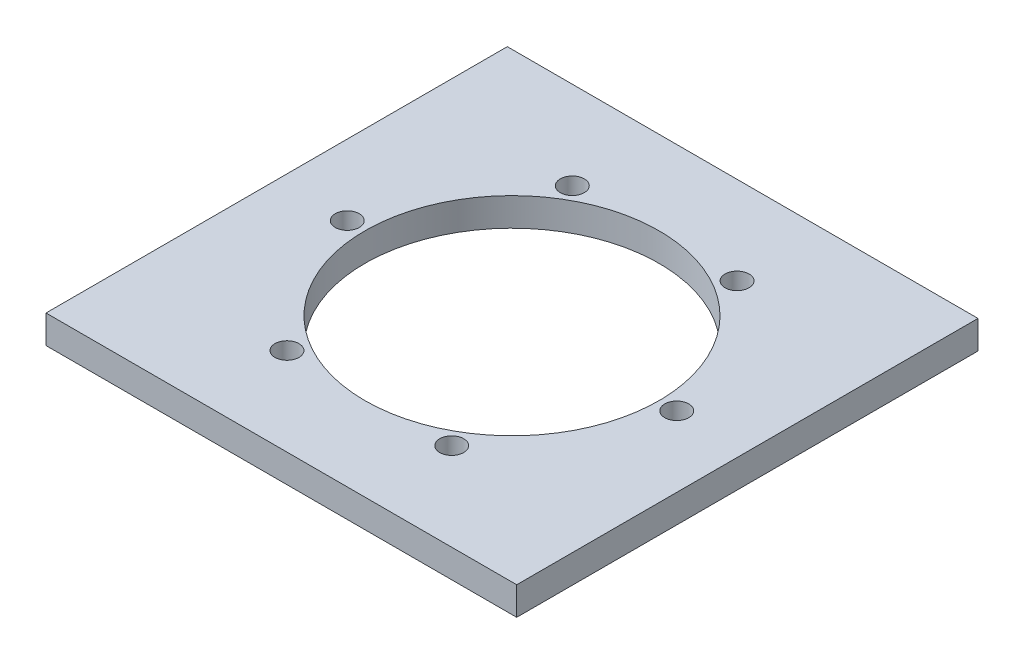
ISO-10303-21;
HEADER;
FILE_DESCRIPTION(('STEP AP214'),'2;1');
FILE_NAME('part.step','',(''),(''),'','','');
FILE_SCHEMA(('AUTOMOTIVE_DESIGN { 1 0 10303 214 1 1 1 1 }'));
ENDSEC;
DATA;
#1=APPLICATION_CONTEXT('core data for automotive mechanical design processes');
#2=APPLICATION_PROTOCOL_DEFINITION('international standard','automotive_design',2000,#1);
#3=PRODUCT_CONTEXT('',#1,'mechanical');
#4=PRODUCT('Part','Part','',(#3));
#5=PRODUCT_RELATED_PRODUCT_CATEGORY('part','',(#4));
#6=PRODUCT_DEFINITION_FORMATION('','',#4);
#7=PRODUCT_DEFINITION_CONTEXT('part definition',#1,'design');
#8=PRODUCT_DEFINITION('design','',#6,#7);
#9=PRODUCT_DEFINITION_SHAPE('','',#8);
#10=(LENGTH_UNIT() NAMED_UNIT(*) SI_UNIT(.MILLI.,.METRE.));
#11=(NAMED_UNIT(*) PLANE_ANGLE_UNIT() SI_UNIT($,.RADIAN.));
#12=(NAMED_UNIT(*) SI_UNIT($,.STERADIAN.) SOLID_ANGLE_UNIT());
#13=UNCERTAINTY_MEASURE_WITH_UNIT(LENGTH_MEASURE(1.E-05),#10,'distance_accuracy_value','');
#14=(GEOMETRIC_REPRESENTATION_CONTEXT(3) GLOBAL_UNCERTAINTY_ASSIGNED_CONTEXT((#13)) GLOBAL_UNIT_ASSIGNED_CONTEXT((#10,
#11,#12)) REPRESENTATION_CONTEXT('',''));
#15=CARTESIAN_POINT('',(0.,0.,0.));
#16=DIRECTION('',(0.,0.,1.));
#17=DIRECTION('',(1.,0.,0.));
#18=AXIS2_PLACEMENT_3D('',#15,#16,#17);
#19=CARTESIAN_POINT('',(0.,0.,0.));
#20=DIRECTION('',(0.,-1.,0.));
#21=DIRECTION('',(0.,0.,-1.));
#22=AXIS2_PLACEMENT_3D('',#19,#20,#21);
#23=PLANE('',#22);
#24=DIRECTION('',(0.,0.,-1.));
#25=VECTOR('',#24,1.);
#26=CARTESIAN_POINT('',(-100.,0.,98.));
#27=LINE('',#26,#25);
#28=CARTESIAN_POINT('',(-100.,0.,98.));
#29=VERTEX_POINT('',#28);
#30=CARTESIAN_POINT('',(-100.,0.,-98.));
#31=VERTEX_POINT('',#30);
#32=EDGE_CURVE('E56',#29,#31,#27,.T.);
#33=ORIENTED_EDGE('',*,*,#32,.T.);
#34=DIRECTION('',(1.,0.,0.));
#35=VECTOR('',#34,1.);
#36=CARTESIAN_POINT('',(-100.,0.,-98.));
#37=LINE('',#36,#35);
#38=CARTESIAN_POINT('',(100.,0.,-98.));
#39=VERTEX_POINT('',#38);
#40=EDGE_CURVE('E265',#31,#39,#37,.T.);
#41=ORIENTED_EDGE('',*,*,#40,.T.);
#42=DIRECTION('',(0.,0.,1.));
#43=VECTOR('',#42,1.);
#44=CARTESIAN_POINT('',(100.,0.,98.));
#45=LINE('',#44,#43);
#46=CARTESIAN_POINT('',(100.,0.,98.));
#47=VERTEX_POINT('',#46);
#48=EDGE_CURVE('E61',#39,#47,#45,.T.);
#49=ORIENTED_EDGE('',*,*,#48,.T.);
#50=DIRECTION('',(-1.,0.,0.));
#51=VECTOR('',#50,1.);
#52=CARTESIAN_POINT('',(-100.,0.,98.));
#53=LINE('',#52,#51);
#54=EDGE_CURVE('E59',#47,#29,#53,.T.);
#55=ORIENTED_EDGE('',*,*,#54,.T.);
#56=EDGE_LOOP('',(#33,#41,#49,#55));
#57=FACE_BOUND('',#56,.T.);
#58=CARTESIAN_POINT('',(0.,0.,0.));
#59=DIRECTION('',(0.,1.,0.));
#60=DIRECTION('',(0.,0.,1.));
#61=AXIS2_PLACEMENT_3D('',#58,#59,#60);
#62=CIRCLE('',#61,62.5);
#63=CARTESIAN_POINT('',(0.,0.,62.5));
#64=VERTEX_POINT('',#63);
#65=EDGE_CURVE('E109',#64,#64,#62,.T.);
#66=ORIENTED_EDGE('',*,*,#65,.T.);
#67=EDGE_LOOP('',(#66));
#68=FACE_BOUND('',#67,.T.);
#69=CARTESIAN_POINT('',(-70.,0.,0.));
#70=DIRECTION('',(0.,1.,0.));
#71=DIRECTION('',(0.,0.,1.));
#72=AXIS2_PLACEMENT_3D('',#69,#70,#71);
#73=CIRCLE('',#72,5.1);
#74=CARTESIAN_POINT('',(-70.,0.,5.10000000000001));
#75=VERTEX_POINT('',#74);
#76=EDGE_CURVE('E106',#75,#75,#73,.T.);
#77=ORIENTED_EDGE('',*,*,#76,.T.);
#78=EDGE_LOOP('',(#77));
#79=FACE_BOUND('',#78,.T.);
#80=CARTESIAN_POINT('',(-35.,0.,60.6217782649108));
#81=DIRECTION('',(0.,1.,0.));
#82=DIRECTION('',(0.,0.,1.));
#83=AXIS2_PLACEMENT_3D('',#80,#81,#82);
#84=CIRCLE('',#83,5.1);
#85=CARTESIAN_POINT('',(-35.,0.,65.7217782649108));
#86=VERTEX_POINT('',#85);
#87=EDGE_CURVE('E103',#86,#86,#84,.T.);
#88=ORIENTED_EDGE('',*,*,#87,.T.);
#89=EDGE_LOOP('',(#88));
#90=FACE_BOUND('',#89,.T.);
#91=CARTESIAN_POINT('',(35.,0.,60.6217782649106));
#92=DIRECTION('',(0.,1.,0.));
#93=DIRECTION('',(0.,0.,1.));
#94=AXIS2_PLACEMENT_3D('',#91,#92,#93);
#95=CIRCLE('',#94,5.1);
#96=CARTESIAN_POINT('',(35.,0.,65.7217782649106));
#97=VERTEX_POINT('',#96);
#98=EDGE_CURVE('E100',#97,#97,#95,.T.);
#99=ORIENTED_EDGE('',*,*,#98,.T.);
#100=EDGE_LOOP('',(#99));
#101=FACE_BOUND('',#100,.T.);
#102=CARTESIAN_POINT('',(70.,0.,0.));
#103=DIRECTION('',(0.,1.,0.));
#104=DIRECTION('',(0.,0.,1.));
#105=AXIS2_PLACEMENT_3D('',#102,#103,#104);
#106=CIRCLE('',#105,5.1);
#107=CARTESIAN_POINT('',(70.,0.,5.09999999999999));
#108=VERTEX_POINT('',#107);
#109=EDGE_CURVE('E67',#108,#108,#106,.T.);
#110=ORIENTED_EDGE('',*,*,#109,.T.);
#111=EDGE_LOOP('',(#110));
#112=FACE_BOUND('',#111,.T.);
#113=CARTESIAN_POINT('',(34.9999999999995,0.,-60.621778264911));
#114=DIRECTION('',(0.,1.,0.));
#115=DIRECTION('',(0.,0.,1.));
#116=AXIS2_PLACEMENT_3D('',#113,#114,#115);
#117=CIRCLE('',#116,5.1);
#118=CARTESIAN_POINT('',(34.9999999999995,0.,-55.521778264911));
#119=VERTEX_POINT('',#118);
#120=EDGE_CURVE('E113',#119,#119,#117,.T.);
#121=ORIENTED_EDGE('',*,*,#120,.T.);
#122=EDGE_LOOP('',(#121));
#123=FACE_BOUND('',#122,.T.);
#124=CARTESIAN_POINT('',(-35.0000000000007,0.,-60.6217782649103));
#125=DIRECTION('',(0.,1.,0.));
#126=DIRECTION('',(0.,0.,1.));
#127=AXIS2_PLACEMENT_3D('',#124,#125,#126);
#128=CIRCLE('',#127,5.1);
#129=CARTESIAN_POINT('',(-35.0000000000007,0.,-55.5217782649103));
#130=VERTEX_POINT('',#129);
#131=EDGE_CURVE('E20',#130,#130,#128,.T.);
#132=ORIENTED_EDGE('',*,*,#131,.T.);
#133=EDGE_LOOP('',(#132));
#134=FACE_BOUND('',#133,.T.);
#135=ADVANCED_FACE('F17',(#57,#68,#79,#90,#101,#112,#123,#134),#23,.T.);
#136=CARTESIAN_POINT('',(-35.0000000000007,12.,-60.6217782649103));
#137=DIRECTION('',(0.,1.,0.));
#138=DIRECTION('',(0.,0.,1.));
#139=AXIS2_PLACEMENT_3D('',#136,#137,#138);
#140=CYLINDRICAL_SURFACE('',#139,5.1);
#141=ORIENTED_EDGE('',*,*,#131,.F.);
#142=EDGE_LOOP('',(#141));
#143=FACE_BOUND('',#142,.T.);
#144=CARTESIAN_POINT('',(-35.0000000000007,12.,-60.6217782649103));
#145=DIRECTION('',(0.,1.,0.));
#146=DIRECTION('',(0.,0.,1.));
#147=AXIS2_PLACEMENT_3D('',#144,#145,#146);
#148=CIRCLE('',#147,5.1);
#149=CARTESIAN_POINT('',(-35.0000000000007,12.,-55.5217782649103));
#150=VERTEX_POINT('',#149);
#151=EDGE_CURVE('E97',#150,#150,#148,.T.);
#152=ORIENTED_EDGE('',*,*,#151,.T.);
#153=EDGE_LOOP('',(#152));
#154=FACE_BOUND('',#153,.T.);
#155=ADVANCED_FACE('F121',(#143,#154),#140,.F.);
#156=CARTESIAN_POINT('',(34.9999999999995,12.,-60.621778264911));
#157=DIRECTION('',(0.,1.,0.));
#158=DIRECTION('',(0.,0.,1.));
#159=AXIS2_PLACEMENT_3D('',#156,#157,#158);
#160=CYLINDRICAL_SURFACE('',#159,5.1);
#161=ORIENTED_EDGE('',*,*,#120,.F.);
#162=EDGE_LOOP('',(#161));
#163=FACE_BOUND('',#162,.T.);
#164=CARTESIAN_POINT('',(34.9999999999995,12.,-60.621778264911));
#165=DIRECTION('',(0.,1.,0.));
#166=DIRECTION('',(0.,0.,1.));
#167=AXIS2_PLACEMENT_3D('',#164,#165,#166);
#168=CIRCLE('',#167,5.1);
#169=CARTESIAN_POINT('',(34.9999999999995,12.,-55.521778264911));
#170=VERTEX_POINT('',#169);
#171=EDGE_CURVE('E94',#170,#170,#168,.T.);
#172=ORIENTED_EDGE('',*,*,#171,.T.);
#173=EDGE_LOOP('',(#172));
#174=FACE_BOUND('',#173,.T.);
#175=ADVANCED_FACE('F124',(#163,#174),#160,.F.);
#176=CARTESIAN_POINT('',(70.,12.,0.));
#177=DIRECTION('',(0.,1.,0.));
#178=DIRECTION('',(0.,0.,1.));
#179=AXIS2_PLACEMENT_3D('',#176,#177,#178);
#180=CYLINDRICAL_SURFACE('',#179,5.1);
#181=ORIENTED_EDGE('',*,*,#109,.F.);
#182=EDGE_LOOP('',(#181));
#183=FACE_BOUND('',#182,.T.);
#184=CARTESIAN_POINT('',(70.,12.,0.));
#185=DIRECTION('',(0.,1.,0.));
#186=DIRECTION('',(0.,0.,1.));
#187=AXIS2_PLACEMENT_3D('',#184,#185,#186);
#188=CIRCLE('',#187,5.1);
#189=CARTESIAN_POINT('',(70.,12.,5.09999999999999));
#190=VERTEX_POINT('',#189);
#191=EDGE_CURVE('E91',#190,#190,#188,.T.);
#192=ORIENTED_EDGE('',*,*,#191,.T.);
#193=EDGE_LOOP('',(#192));
#194=FACE_BOUND('',#193,.T.);
#195=ADVANCED_FACE('F165',(#183,#194),#180,.F.);
#196=CARTESIAN_POINT('',(-100.,12.,98.));
#197=DIRECTION('',(0.,0.,-1.));
#198=DIRECTION('',(-1.,0.,0.));
#199=AXIS2_PLACEMENT_3D('',#196,#197,#198);
#200=PLANE('',#199);
#201=DIRECTION('',(0.,1.,0.));
#202=VECTOR('',#201,1.);
#203=CARTESIAN_POINT('',(100.,12.,98.));
#204=LINE('',#203,#202);
#205=CARTESIAN_POINT('',(100.,12.,98.));
#206=VERTEX_POINT('',#205);
#207=EDGE_CURVE('E275',#47,#206,#204,.T.);
#208=ORIENTED_EDGE('',*,*,#207,.T.);
#209=DIRECTION('',(1.,0.,0.));
#210=VECTOR('',#209,1.);
#211=CARTESIAN_POINT('',(0.,12.,98.));
#212=LINE('',#211,#210);
#213=CARTESIAN_POINT('',(-100.,12.,98.));
#214=VERTEX_POINT('',#213);
#215=EDGE_CURVE('E78',#206,#214,#212,.F.);
#216=ORIENTED_EDGE('',*,*,#215,.T.);
#217=DIRECTION('',(0.,1.,0.));
#218=VECTOR('',#217,1.);
#219=CARTESIAN_POINT('',(-100.,12.,98.));
#220=LINE('',#219,#218);
#221=EDGE_CURVE('E66',#214,#29,#220,.F.);
#222=ORIENTED_EDGE('',*,*,#221,.T.);
#223=ORIENTED_EDGE('',*,*,#54,.F.);
#224=EDGE_LOOP('',(#208,#216,#222,#223));
#225=FACE_BOUND('',#224,.T.);
#226=ADVANCED_FACE('F77',(#225),#200,.F.);
#227=CARTESIAN_POINT('',(-100.,12.,98.));
#228=DIRECTION('',(1.,0.,0.));
#229=DIRECTION('',(0.,0.,-1.));
#230=AXIS2_PLACEMENT_3D('',#227,#228,#229);
#231=PLANE('',#230);
#232=ORIENTED_EDGE('',*,*,#221,.F.);
#233=DIRECTION('',(0.,0.,-1.));
#234=VECTOR('',#233,1.);
#235=CARTESIAN_POINT('',(-100.,12.,0.));
#236=LINE('',#235,#234);
#237=CARTESIAN_POINT('',(-100.,12.,-98.));
#238=VERTEX_POINT('',#237);
#239=EDGE_CURVE('E267',#214,#238,#236,.T.);
#240=ORIENTED_EDGE('',*,*,#239,.T.);
#241=DIRECTION('',(0.,1.,0.));
#242=VECTOR('',#241,1.);
#243=CARTESIAN_POINT('',(-100.,12.,-98.));
#244=LINE('',#243,#242);
#245=EDGE_CURVE('E74',#238,#31,#244,.F.);
#246=ORIENTED_EDGE('',*,*,#245,.T.);
#247=ORIENTED_EDGE('',*,*,#32,.F.);
#248=EDGE_LOOP('',(#232,#240,#246,#247));
#249=FACE_BOUND('',#248,.T.);
#250=ADVANCED_FACE('F71',(#249),#231,.F.);
#251=CARTESIAN_POINT('',(-100.,12.,-98.));
#252=DIRECTION('',(0.,0.,1.));
#253=DIRECTION('',(1.,0.,0.));
#254=AXIS2_PLACEMENT_3D('',#251,#252,#253);
#255=PLANE('',#254);
#256=ORIENTED_EDGE('',*,*,#245,.F.);
#257=DIRECTION('',(1.,0.,0.));
#258=VECTOR('',#257,1.);
#259=CARTESIAN_POINT('',(0.,12.,-98.));
#260=LINE('',#259,#258);
#261=CARTESIAN_POINT('',(100.,12.,-98.));
#262=VERTEX_POINT('',#261);
#263=EDGE_CURVE('E264',#238,#262,#260,.T.);
#264=ORIENTED_EDGE('',*,*,#263,.T.);
#265=DIRECTION('',(0.,1.,0.));
#266=VECTOR('',#265,1.);
#267=CARTESIAN_POINT('',(100.,12.,-98.));
#268=LINE('',#267,#266);
#269=EDGE_CURVE('E35',#262,#39,#268,.F.);
#270=ORIENTED_EDGE('',*,*,#269,.T.);
#271=ORIENTED_EDGE('',*,*,#40,.F.);
#272=EDGE_LOOP('',(#256,#264,#270,#271));
#273=FACE_BOUND('',#272,.T.);
#274=ADVANCED_FACE('F157',(#273),#255,.F.);
#275=CARTESIAN_POINT('',(100.,12.,98.));
#276=DIRECTION('',(-1.,0.,0.));
#277=DIRECTION('',(0.,0.,1.));
#278=AXIS2_PLACEMENT_3D('',#275,#276,#277);
#279=PLANE('',#278);
#280=ORIENTED_EDGE('',*,*,#269,.F.);
#281=DIRECTION('',(0.,0.,-1.));
#282=VECTOR('',#281,1.);
#283=CARTESIAN_POINT('',(100.,12.,0.));
#284=LINE('',#283,#282);
#285=EDGE_CURVE('E90',#262,#206,#284,.F.);
#286=ORIENTED_EDGE('',*,*,#285,.T.);
#287=ORIENTED_EDGE('',*,*,#207,.F.);
#288=ORIENTED_EDGE('',*,*,#48,.F.);
#289=EDGE_LOOP('',(#280,#286,#287,#288));
#290=FACE_BOUND('',#289,.T.);
#291=ADVANCED_FACE('F153',(#290),#279,.F.);
#292=CARTESIAN_POINT('',(0.,0.,0.));
#293=DIRECTION('',(0.,1.,0.));
#294=DIRECTION('',(0.,0.,1.));
#295=AXIS2_PLACEMENT_3D('',#292,#293,#294);
#296=CYLINDRICAL_SURFACE('',#295,62.5);
#297=ORIENTED_EDGE('',*,*,#65,.F.);
#298=EDGE_LOOP('',(#297));
#299=FACE_BOUND('',#298,.T.);
#300=CARTESIAN_POINT('',(0.,12.,0.));
#301=DIRECTION('',(0.,1.,0.));
#302=DIRECTION('',(0.,0.,1.));
#303=AXIS2_PLACEMENT_3D('',#300,#301,#302);
#304=CIRCLE('',#303,62.5);
#305=CARTESIAN_POINT('',(0.,12.,62.5));
#306=VERTEX_POINT('',#305);
#307=EDGE_CURVE('E87',#306,#306,#304,.T.);
#308=ORIENTED_EDGE('',*,*,#307,.T.);
#309=EDGE_LOOP('',(#308));
#310=FACE_BOUND('',#309,.T.);
#311=ADVANCED_FACE('F149',(#299,#310),#296,.F.);
#312=CARTESIAN_POINT('',(-70.,12.,0.));
#313=DIRECTION('',(0.,1.,0.));
#314=DIRECTION('',(0.,0.,1.));
#315=AXIS2_PLACEMENT_3D('',#312,#313,#314);
#316=CYLINDRICAL_SURFACE('',#315,5.1);
#317=ORIENTED_EDGE('',*,*,#76,.F.);
#318=EDGE_LOOP('',(#317));
#319=FACE_BOUND('',#318,.T.);
#320=CARTESIAN_POINT('',(-70.,12.,0.));
#321=DIRECTION('',(0.,1.,0.));
#322=DIRECTION('',(0.,0.,1.));
#323=AXIS2_PLACEMENT_3D('',#320,#321,#322);
#324=CIRCLE('',#323,5.1);
#325=CARTESIAN_POINT('',(-70.,12.,5.10000000000001));
#326=VERTEX_POINT('',#325);
#327=EDGE_CURVE('E84',#326,#326,#324,.T.);
#328=ORIENTED_EDGE('',*,*,#327,.T.);
#329=EDGE_LOOP('',(#328));
#330=FACE_BOUND('',#329,.T.);
#331=ADVANCED_FACE('F145',(#319,#330),#316,.F.);
#332=CARTESIAN_POINT('',(-35.,12.,60.6217782649108));
#333=DIRECTION('',(0.,1.,0.));
#334=DIRECTION('',(0.,0.,1.));
#335=AXIS2_PLACEMENT_3D('',#332,#333,#334);
#336=CYLINDRICAL_SURFACE('',#335,5.1);
#337=ORIENTED_EDGE('',*,*,#87,.F.);
#338=EDGE_LOOP('',(#337));
#339=FACE_BOUND('',#338,.T.);
#340=CARTESIAN_POINT('',(-35.,12.,60.6217782649108));
#341=DIRECTION('',(0.,1.,0.));
#342=DIRECTION('',(0.,0.,1.));
#343=AXIS2_PLACEMENT_3D('',#340,#341,#342);
#344=CIRCLE('',#343,5.1);
#345=CARTESIAN_POINT('',(-35.,12.,65.7217782649108));
#346=VERTEX_POINT('',#345);
#347=EDGE_CURVE('E26',#346,#346,#344,.T.);
#348=ORIENTED_EDGE('',*,*,#347,.T.);
#349=EDGE_LOOP('',(#348));
#350=FACE_BOUND('',#349,.T.);
#351=ADVANCED_FACE('F137',(#339,#350),#336,.F.);
#352=CARTESIAN_POINT('',(35.,12.,60.6217782649106));
#353=DIRECTION('',(0.,1.,0.));
#354=DIRECTION('',(0.,0.,1.));
#355=AXIS2_PLACEMENT_3D('',#352,#353,#354);
#356=CYLINDRICAL_SURFACE('',#355,5.1);
#357=ORIENTED_EDGE('',*,*,#98,.F.);
#358=EDGE_LOOP('',(#357));
#359=FACE_BOUND('',#358,.T.);
#360=CARTESIAN_POINT('',(35.,12.,60.6217782649106));
#361=DIRECTION('',(0.,1.,0.));
#362=DIRECTION('',(0.,0.,1.));
#363=AXIS2_PLACEMENT_3D('',#360,#361,#362);
#364=CIRCLE('',#363,5.1);
#365=CARTESIAN_POINT('',(35.,12.,65.7217782649106));
#366=VERTEX_POINT('',#365);
#367=EDGE_CURVE('E11',#366,#366,#364,.T.);
#368=ORIENTED_EDGE('',*,*,#367,.T.);
#369=EDGE_LOOP('',(#368));
#370=FACE_BOUND('',#369,.T.);
#371=ADVANCED_FACE('F129',(#359,#370),#356,.F.);
#372=CARTESIAN_POINT('',(0.,12.,0.));
#373=DIRECTION('',(0.,-1.,0.));
#374=DIRECTION('',(0.,0.,-1.));
#375=AXIS2_PLACEMENT_3D('',#372,#373,#374);
#376=PLANE('',#375);
#377=ORIENTED_EDGE('',*,*,#367,.F.);
#378=EDGE_LOOP('',(#377));
#379=FACE_BOUND('',#378,.T.);
#380=ORIENTED_EDGE('',*,*,#347,.F.);
#381=EDGE_LOOP('',(#380));
#382=FACE_BOUND('',#381,.T.);
#383=ORIENTED_EDGE('',*,*,#327,.F.);
#384=EDGE_LOOP('',(#383));
#385=FACE_BOUND('',#384,.T.);
#386=ORIENTED_EDGE('',*,*,#307,.F.);
#387=EDGE_LOOP('',(#386));
#388=FACE_BOUND('',#387,.T.);
#389=ORIENTED_EDGE('',*,*,#263,.F.);
#390=ORIENTED_EDGE('',*,*,#239,.F.);
#391=ORIENTED_EDGE('',*,*,#215,.F.);
#392=ORIENTED_EDGE('',*,*,#285,.F.);
#393=EDGE_LOOP('',(#389,#390,#391,#392));
#394=FACE_BOUND('',#393,.T.);
#395=ORIENTED_EDGE('',*,*,#191,.F.);
#396=EDGE_LOOP('',(#395));
#397=FACE_BOUND('',#396,.T.);
#398=ORIENTED_EDGE('',*,*,#171,.F.);
#399=EDGE_LOOP('',(#398));
#400=FACE_BOUND('',#399,.T.);
#401=ORIENTED_EDGE('',*,*,#151,.F.);
#402=EDGE_LOOP('',(#401));
#403=FACE_BOUND('',#402,.T.);
#404=ADVANCED_FACE('F127',(#379,#382,#385,#388,#394,#397,#400,#403),#376,.F.);
#405=CLOSED_SHELL('',(#135,#155,#175,#195,#226,#250,#274,#291,#311,#331,#351,#371,#404));
#406=MANIFOLD_SOLID_BREP('B1',#405);
#407=ADVANCED_BREP_SHAPE_REPRESENTATION('',(#18,#406),#14);
#408=SHAPE_DEFINITION_REPRESENTATION(#9,#407);
ENDSEC;
END-ISO-10303-21;
